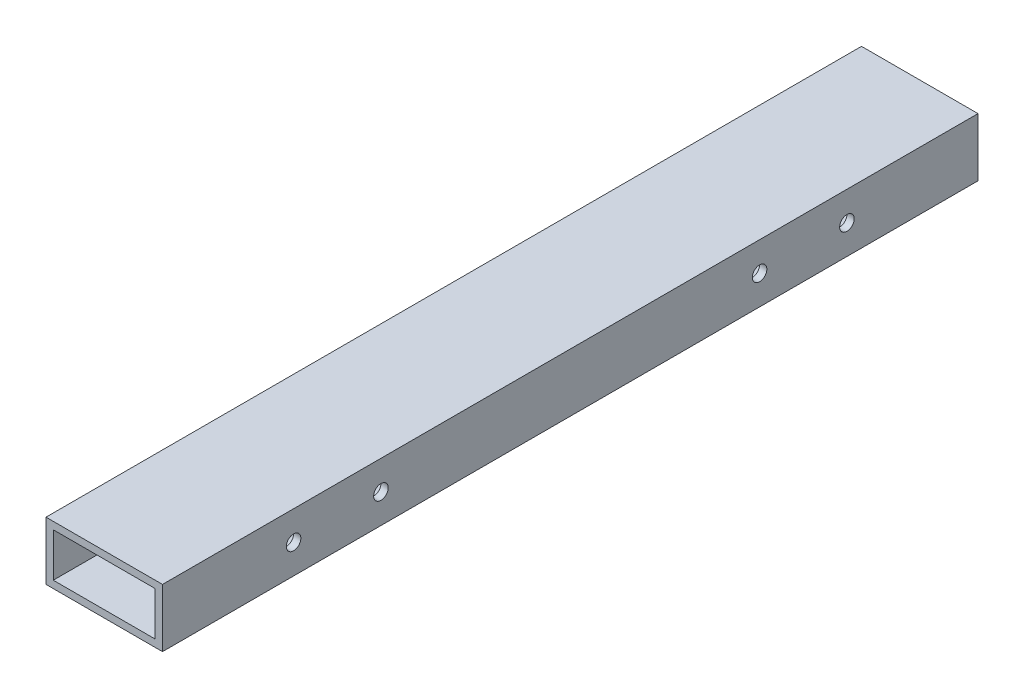
ISO-10303-21;
HEADER;
FILE_DESCRIPTION(('STEP AP214'),'2;1');
FILE_NAME('part.step','',(''),(''),'','','');
FILE_SCHEMA(('AUTOMOTIVE_DESIGN { 1 0 10303 214 1 1 1 1 }'));
ENDSEC;
DATA;
#1=APPLICATION_CONTEXT('core data for automotive mechanical design processes');
#2=APPLICATION_PROTOCOL_DEFINITION('international standard','automotive_design',2000,#1);
#3=PRODUCT_CONTEXT('',#1,'mechanical');
#4=PRODUCT('Part','Part','',(#3));
#5=PRODUCT_RELATED_PRODUCT_CATEGORY('part','',(#4));
#6=PRODUCT_DEFINITION_FORMATION('','',#4);
#7=PRODUCT_DEFINITION_CONTEXT('part definition',#1,'design');
#8=PRODUCT_DEFINITION('design','',#6,#7);
#9=PRODUCT_DEFINITION_SHAPE('','',#8);
#10=(LENGTH_UNIT() NAMED_UNIT(*) SI_UNIT(.MILLI.,.METRE.));
#11=(NAMED_UNIT(*) PLANE_ANGLE_UNIT() SI_UNIT($,.RADIAN.));
#12=(NAMED_UNIT(*) SI_UNIT($,.STERADIAN.) SOLID_ANGLE_UNIT());
#13=UNCERTAINTY_MEASURE_WITH_UNIT(LENGTH_MEASURE(1.E-05),#10,'distance_accuracy_value','');
#14=(GEOMETRIC_REPRESENTATION_CONTEXT(3) GLOBAL_UNCERTAINTY_ASSIGNED_CONTEXT((#13)) GLOBAL_UNIT_ASSIGNED_CONTEXT((#10,
#11,#12)) REPRESENTATION_CONTEXT('',''));
#15=CARTESIAN_POINT('',(0.,0.,0.));
#16=DIRECTION('',(0.,0.,1.));
#17=DIRECTION('',(1.,0.,0.));
#18=AXIS2_PLACEMENT_3D('',#15,#16,#17);
#19=CARTESIAN_POINT('',(0.,0.,355.6));
#20=DIRECTION('',(0.,0.,-1.));
#21=DIRECTION('',(-1.,0.,0.));
#22=AXIS2_PLACEMENT_3D('',#19,#20,#21);
#23=PLANE('',#22);
#24=DIRECTION('',(0.,-1.,0.));
#25=VECTOR('',#24,1.);
#26=CARTESIAN_POINT('',(0.,0.,355.6));
#27=LINE('',#26,#25);
#28=CARTESIAN_POINT('',(0.,25.4,355.6));
#29=VERTEX_POINT('',#28);
#30=CARTESIAN_POINT('',(0.,0.,355.6));
#31=VERTEX_POINT('',#30);
#32=EDGE_CURVE('E144',#29,#31,#27,.T.);
#33=ORIENTED_EDGE('',*,*,#32,.T.);
#34=DIRECTION('',(1.,0.,0.));
#35=VECTOR('',#34,1.);
#36=CARTESIAN_POINT('',(0.,0.,355.6));
#37=LINE('',#36,#35);
#38=CARTESIAN_POINT('',(50.8,0.,355.6));
#39=VERTEX_POINT('',#38);
#40=EDGE_CURVE('E147',#31,#39,#37,.T.);
#41=ORIENTED_EDGE('',*,*,#40,.T.);
#42=DIRECTION('',(0.,1.,0.));
#43=VECTOR('',#42,1.);
#44=CARTESIAN_POINT('',(50.8,0.,355.6));
#45=LINE('',#44,#43);
#46=CARTESIAN_POINT('',(50.8,25.4,355.6));
#47=VERTEX_POINT('',#46);
#48=EDGE_CURVE('E150',#39,#47,#45,.T.);
#49=ORIENTED_EDGE('',*,*,#48,.T.);
#50=DIRECTION('',(-1.,0.,0.));
#51=VECTOR('',#50,1.);
#52=CARTESIAN_POINT('',(0.,25.4,355.6));
#53=LINE('',#52,#51);
#54=EDGE_CURVE('E152',#47,#29,#53,.T.);
#55=ORIENTED_EDGE('',*,*,#54,.T.);
#56=EDGE_LOOP('',(#33,#41,#49,#55));
#57=FACE_BOUND('',#56,.T.);
#58=DIRECTION('',(0.,-1.,0.));
#59=VECTOR('',#58,1.);
#60=CARTESIAN_POINT('',(3.175,3.175,355.6));
#61=LINE('',#60,#59);
#62=CARTESIAN_POINT('',(3.175,22.225,355.6));
#63=VERTEX_POINT('',#62);
#64=CARTESIAN_POINT('',(3.175,3.175,355.6));
#65=VERTEX_POINT('',#64);
#66=EDGE_CURVE('E106',#63,#65,#61,.T.);
#67=ORIENTED_EDGE('',*,*,#66,.F.);
#68=DIRECTION('',(-1.,0.,0.));
#69=VECTOR('',#68,1.);
#70=CARTESIAN_POINT('',(3.175,22.225,355.6));
#71=LINE('',#70,#69);
#72=CARTESIAN_POINT('',(47.625,22.225,355.6));
#73=VERTEX_POINT('',#72);
#74=EDGE_CURVE('E128',#73,#63,#71,.T.);
#75=ORIENTED_EDGE('',*,*,#74,.F.);
#76=DIRECTION('',(0.,1.,0.));
#77=VECTOR('',#76,1.);
#78=CARTESIAN_POINT('',(47.625,3.175,355.6));
#79=LINE('',#78,#77);
#80=CARTESIAN_POINT('',(47.625,3.175,355.6));
#81=VERTEX_POINT('',#80);
#82=EDGE_CURVE('E126',#81,#73,#79,.T.);
#83=ORIENTED_EDGE('',*,*,#82,.F.);
#84=DIRECTION('',(1.,0.,0.));
#85=VECTOR('',#84,1.);
#86=CARTESIAN_POINT('',(3.175,3.175,355.6));
#87=LINE('',#86,#85);
#88=EDGE_CURVE('E114',#65,#81,#87,.T.);
#89=ORIENTED_EDGE('',*,*,#88,.F.);
#90=EDGE_LOOP('',(#67,#75,#83,#89));
#91=FACE_BOUND('',#90,.T.);
#92=ADVANCED_FACE('F39',(#57,#91),#23,.F.);
#93=CARTESIAN_POINT('',(0.,0.,0.));
#94=DIRECTION('',(0.,0.,-1.));
#95=DIRECTION('',(-1.,0.,0.));
#96=AXIS2_PLACEMENT_3D('',#93,#94,#95);
#97=PLANE('',#96);
#98=DIRECTION('',(0.,-1.,0.));
#99=VECTOR('',#98,1.);
#100=CARTESIAN_POINT('',(0.,0.,0.));
#101=LINE('',#100,#99);
#102=CARTESIAN_POINT('',(0.,25.4,0.));
#103=VERTEX_POINT('',#102);
#104=CARTESIAN_POINT('',(0.,0.,0.));
#105=VERTEX_POINT('',#104);
#106=EDGE_CURVE('E122',#103,#105,#101,.T.);
#107=ORIENTED_EDGE('',*,*,#106,.F.);
#108=DIRECTION('',(-1.,0.,0.));
#109=VECTOR('',#108,1.);
#110=CARTESIAN_POINT('',(0.,25.4,0.));
#111=LINE('',#110,#109);
#112=CARTESIAN_POINT('',(50.8,25.4,0.));
#113=VERTEX_POINT('',#112);
#114=EDGE_CURVE('E148',#113,#103,#111,.T.);
#115=ORIENTED_EDGE('',*,*,#114,.F.);
#116=DIRECTION('',(0.,1.,0.));
#117=VECTOR('',#116,1.);
#118=CARTESIAN_POINT('',(50.8,0.,0.));
#119=LINE('',#118,#117);
#120=CARTESIAN_POINT('',(50.8,0.,0.));
#121=VERTEX_POINT('',#120);
#122=EDGE_CURVE('E159',#121,#113,#119,.T.);
#123=ORIENTED_EDGE('',*,*,#122,.F.);
#124=DIRECTION('',(1.,0.,0.));
#125=VECTOR('',#124,1.);
#126=CARTESIAN_POINT('',(0.,0.,0.));
#127=LINE('',#126,#125);
#128=EDGE_CURVE('E157',#105,#121,#127,.T.);
#129=ORIENTED_EDGE('',*,*,#128,.F.);
#130=EDGE_LOOP('',(#107,#115,#123,#129));
#131=FACE_BOUND('',#130,.T.);
#132=DIRECTION('',(-1.,0.,0.));
#133=VECTOR('',#132,1.);
#134=CARTESIAN_POINT('',(3.175,22.225,0.));
#135=LINE('',#134,#133);
#136=CARTESIAN_POINT('',(47.625,22.225,0.));
#137=VERTEX_POINT('',#136);
#138=CARTESIAN_POINT('',(3.175,22.225,0.));
#139=VERTEX_POINT('',#138);
#140=EDGE_CURVE('E115',#137,#139,#135,.T.);
#141=ORIENTED_EDGE('',*,*,#140,.T.);
#142=DIRECTION('',(0.,-1.,0.));
#143=VECTOR('',#142,1.);
#144=CARTESIAN_POINT('',(3.175,3.175,0.));
#145=LINE('',#144,#143);
#146=CARTESIAN_POINT('',(3.175,3.175,0.));
#147=VERTEX_POINT('',#146);
#148=EDGE_CURVE('E64',#139,#147,#145,.T.);
#149=ORIENTED_EDGE('',*,*,#148,.T.);
#150=DIRECTION('',(1.,0.,0.));
#151=VECTOR('',#150,1.);
#152=CARTESIAN_POINT('',(3.175,3.175,0.));
#153=LINE('',#152,#151);
#154=CARTESIAN_POINT('',(47.625,3.175,0.));
#155=VERTEX_POINT('',#154);
#156=EDGE_CURVE('E121',#147,#155,#153,.T.);
#157=ORIENTED_EDGE('',*,*,#156,.T.);
#158=DIRECTION('',(0.,1.,0.));
#159=VECTOR('',#158,1.);
#160=CARTESIAN_POINT('',(47.625,3.175,0.));
#161=LINE('',#160,#159);
#162=EDGE_CURVE('E136',#155,#137,#161,.T.);
#163=ORIENTED_EDGE('',*,*,#162,.T.);
#164=EDGE_LOOP('',(#141,#149,#157,#163));
#165=FACE_BOUND('',#164,.T.);
#166=ADVANCED_FACE('F211',(#131,#165),#97,.T.);
#167=CARTESIAN_POINT('',(0.,0.,355.6));
#168=DIRECTION('',(1.,0.,0.));
#169=DIRECTION('',(0.,0.,-1.));
#170=AXIS2_PLACEMENT_3D('',#167,#168,#169);
#171=PLANE('',#170);
#172=CARTESIAN_POINT('',(0.,12.7,298.45));
#173=DIRECTION('',(1.,0.,0.));
#174=DIRECTION('',(0.,0.,-1.));
#175=AXIS2_PLACEMENT_3D('',#172,#173,#174);
#176=CIRCLE('',#175,3.17499999999997);
#177=CARTESIAN_POINT('',(0.,12.7,295.275));
#178=VERTEX_POINT('',#177);
#179=EDGE_CURVE('E173',#178,#178,#176,.T.);
#180=ORIENTED_EDGE('',*,*,#179,.T.);
#181=EDGE_LOOP('',(#180));
#182=FACE_BOUND('',#181,.T.);
#183=CARTESIAN_POINT('',(0.,12.7,95.25));
#184=DIRECTION('',(1.,0.,0.));
#185=DIRECTION('',(0.,0.,1.));
#186=AXIS2_PLACEMENT_3D('',#183,#184,#185);
#187=CIRCLE('',#186,3.17499999999997);
#188=CARTESIAN_POINT('',(0.,12.7,98.425));
#189=VERTEX_POINT('',#188);
#190=EDGE_CURVE('E269',#189,#189,#187,.T.);
#191=ORIENTED_EDGE('',*,*,#190,.T.);
#192=EDGE_LOOP('',(#191));
#193=FACE_BOUND('',#192,.T.);
#194=CARTESIAN_POINT('',(0.,12.7,57.15));
#195=DIRECTION('',(1.,0.,0.));
#196=DIRECTION('',(0.,0.,1.));
#197=AXIS2_PLACEMENT_3D('',#194,#195,#196);
#198=CIRCLE('',#197,3.17499999999997);
#199=CARTESIAN_POINT('',(0.,12.7,60.3249999999999));
#200=VERTEX_POINT('',#199);
#201=EDGE_CURVE('E273',#200,#200,#198,.T.);
#202=ORIENTED_EDGE('',*,*,#201,.T.);
#203=EDGE_LOOP('',(#202));
#204=FACE_BOUND('',#203,.T.);
#205=CARTESIAN_POINT('',(0.,12.7,260.35));
#206=DIRECTION('',(1.,0.,0.));
#207=DIRECTION('',(0.,0.,-1.));
#208=AXIS2_PLACEMENT_3D('',#205,#206,#207);
#209=CIRCLE('',#208,3.17499999999997);
#210=CARTESIAN_POINT('',(0.,12.7,257.175));
#211=VERTEX_POINT('',#210);
#212=EDGE_CURVE('E276',#211,#211,#209,.T.);
#213=ORIENTED_EDGE('',*,*,#212,.T.);
#214=EDGE_LOOP('',(#213));
#215=FACE_BOUND('',#214,.T.);
#216=ORIENTED_EDGE('',*,*,#106,.T.);
#217=DIRECTION('',(0.,0.,-1.));
#218=VECTOR('',#217,1.);
#219=CARTESIAN_POINT('',(0.,0.,355.6));
#220=LINE('',#219,#218);
#221=EDGE_CURVE('E11',#31,#105,#220,.T.);
#222=ORIENTED_EDGE('',*,*,#221,.F.);
#223=ORIENTED_EDGE('',*,*,#32,.F.);
#224=DIRECTION('',(0.,0.,-1.));
#225=VECTOR('',#224,1.);
#226=CARTESIAN_POINT('',(0.,25.4,355.6));
#227=LINE('',#226,#225);
#228=EDGE_CURVE('E154',#29,#103,#227,.T.);
#229=ORIENTED_EDGE('',*,*,#228,.T.);
#230=EDGE_LOOP('',(#216,#222,#223,#229));
#231=FACE_BOUND('',#230,.T.);
#232=ADVANCED_FACE('F41',(#182,#193,#204,#215,#231),#171,.F.);
#233=CARTESIAN_POINT('',(0.,0.,355.6));
#234=DIRECTION('',(0.,1.,0.));
#235=DIRECTION('',(0.,0.,1.));
#236=AXIS2_PLACEMENT_3D('',#233,#234,#235);
#237=PLANE('',#236);
#238=ORIENTED_EDGE('',*,*,#128,.T.);
#239=DIRECTION('',(0.,0.,-1.));
#240=VECTOR('',#239,1.);
#241=CARTESIAN_POINT('',(50.8,0.,355.6));
#242=LINE('',#241,#240);
#243=EDGE_CURVE('E48',#39,#121,#242,.T.);
#244=ORIENTED_EDGE('',*,*,#243,.F.);
#245=ORIENTED_EDGE('',*,*,#40,.F.);
#246=ORIENTED_EDGE('',*,*,#221,.T.);
#247=EDGE_LOOP('',(#238,#244,#245,#246));
#248=FACE_BOUND('',#247,.T.);
#249=ADVANCED_FACE('F242',(#248),#237,.F.);
#250=CARTESIAN_POINT('',(50.8,0.,355.6));
#251=DIRECTION('',(-1.,0.,0.));
#252=DIRECTION('',(0.,0.,1.));
#253=AXIS2_PLACEMENT_3D('',#250,#251,#252);
#254=PLANE('',#253);
#255=CARTESIAN_POINT('',(50.8,12.7,298.45));
#256=DIRECTION('',(1.,0.,0.));
#257=DIRECTION('',(0.,0.,-1.));
#258=AXIS2_PLACEMENT_3D('',#255,#256,#257);
#259=CIRCLE('',#258,3.17499999999997);
#260=CARTESIAN_POINT('',(50.8,12.7,295.275));
#261=VERTEX_POINT('',#260);
#262=EDGE_CURVE('E282',#261,#261,#259,.T.);
#263=ORIENTED_EDGE('',*,*,#262,.F.);
#264=EDGE_LOOP('',(#263));
#265=FACE_BOUND('',#264,.T.);
#266=CARTESIAN_POINT('',(50.8,12.7,95.25));
#267=DIRECTION('',(1.,0.,0.));
#268=DIRECTION('',(0.,0.,1.));
#269=AXIS2_PLACEMENT_3D('',#266,#267,#268);
#270=CIRCLE('',#269,3.17499999999997);
#271=CARTESIAN_POINT('',(50.8,12.7,98.425));
#272=VERTEX_POINT('',#271);
#273=EDGE_CURVE('E287',#272,#272,#270,.T.);
#274=ORIENTED_EDGE('',*,*,#273,.F.);
#275=EDGE_LOOP('',(#274));
#276=FACE_BOUND('',#275,.T.);
#277=CARTESIAN_POINT('',(50.8,12.7,57.15));
#278=DIRECTION('',(1.,0.,0.));
#279=DIRECTION('',(0.,0.,1.));
#280=AXIS2_PLACEMENT_3D('',#277,#278,#279);
#281=CIRCLE('',#280,3.17499999999997);
#282=CARTESIAN_POINT('',(50.8,12.7,60.3249999999999));
#283=VERTEX_POINT('',#282);
#284=EDGE_CURVE('E279',#283,#283,#281,.T.);
#285=ORIENTED_EDGE('',*,*,#284,.F.);
#286=EDGE_LOOP('',(#285));
#287=FACE_BOUND('',#286,.T.);
#288=CARTESIAN_POINT('',(50.8,12.7,260.35));
#289=DIRECTION('',(1.,0.,0.));
#290=DIRECTION('',(0.,0.,-1.));
#291=AXIS2_PLACEMENT_3D('',#288,#289,#290);
#292=CIRCLE('',#291,3.17499999999997);
#293=CARTESIAN_POINT('',(50.8,12.7,257.175));
#294=VERTEX_POINT('',#293);
#295=EDGE_CURVE('E278',#294,#294,#292,.T.);
#296=ORIENTED_EDGE('',*,*,#295,.F.);
#297=EDGE_LOOP('',(#296));
#298=FACE_BOUND('',#297,.T.);
#299=ORIENTED_EDGE('',*,*,#122,.T.);
#300=DIRECTION('',(0.,0.,-1.));
#301=VECTOR('',#300,1.);
#302=CARTESIAN_POINT('',(50.8,25.4,355.6));
#303=LINE('',#302,#301);
#304=EDGE_CURVE('E164',#47,#113,#303,.T.);
#305=ORIENTED_EDGE('',*,*,#304,.F.);
#306=ORIENTED_EDGE('',*,*,#48,.F.);
#307=ORIENTED_EDGE('',*,*,#243,.T.);
#308=EDGE_LOOP('',(#299,#305,#306,#307));
#309=FACE_BOUND('',#308,.T.);
#310=ADVANCED_FACE('F239',(#265,#276,#287,#298,#309),#254,.F.);
#311=CARTESIAN_POINT('',(0.,25.4,355.6));
#312=DIRECTION('',(0.,-1.,0.));
#313=DIRECTION('',(0.,0.,-1.));
#314=AXIS2_PLACEMENT_3D('',#311,#312,#313);
#315=PLANE('',#314);
#316=ORIENTED_EDGE('',*,*,#114,.T.);
#317=ORIENTED_EDGE('',*,*,#228,.F.);
#318=ORIENTED_EDGE('',*,*,#54,.F.);
#319=ORIENTED_EDGE('',*,*,#304,.T.);
#320=EDGE_LOOP('',(#316,#317,#318,#319));
#321=FACE_BOUND('',#320,.T.);
#322=ADVANCED_FACE('F236',(#321),#315,.F.);
#323=CARTESIAN_POINT('',(3.175,3.175,355.6));
#324=DIRECTION('',(1.,0.,0.));
#325=DIRECTION('',(0.,0.,-1.));
#326=AXIS2_PLACEMENT_3D('',#323,#324,#325);
#327=PLANE('',#326);
#328=CARTESIAN_POINT('',(3.175,12.7,298.45));
#329=DIRECTION('',(1.,0.,0.));
#330=DIRECTION('',(0.,0.,-1.));
#331=AXIS2_PLACEMENT_3D('',#328,#329,#330);
#332=CIRCLE('',#331,3.17499999999997);
#333=CARTESIAN_POINT('',(3.175,12.7,295.275));
#334=VERTEX_POINT('',#333);
#335=EDGE_CURVE('E134',#334,#334,#332,.T.);
#336=ORIENTED_EDGE('',*,*,#335,.F.);
#337=EDGE_LOOP('',(#336));
#338=FACE_BOUND('',#337,.T.);
#339=CARTESIAN_POINT('',(3.175,12.7,95.25));
#340=DIRECTION('',(1.,0.,0.));
#341=DIRECTION('',(0.,0.,-1.));
#342=AXIS2_PLACEMENT_3D('',#339,#340,#341);
#343=CIRCLE('',#342,3.17499999999997);
#344=CARTESIAN_POINT('',(3.175,12.7,92.075));
#345=VERTEX_POINT('',#344);
#346=EDGE_CURVE('E179',#345,#345,#343,.T.);
#347=ORIENTED_EDGE('',*,*,#346,.F.);
#348=EDGE_LOOP('',(#347));
#349=FACE_BOUND('',#348,.T.);
#350=CARTESIAN_POINT('',(3.175,12.7,57.15));
#351=DIRECTION('',(1.,0.,0.));
#352=DIRECTION('',(0.,0.,-1.));
#353=AXIS2_PLACEMENT_3D('',#350,#351,#352);
#354=CIRCLE('',#353,3.17499999999997);
#355=CARTESIAN_POINT('',(3.175,12.7,53.975));
#356=VERTEX_POINT('',#355);
#357=EDGE_CURVE('E176',#356,#356,#354,.T.);
#358=ORIENTED_EDGE('',*,*,#357,.F.);
#359=EDGE_LOOP('',(#358));
#360=FACE_BOUND('',#359,.T.);
#361=CARTESIAN_POINT('',(3.175,12.7,260.35));
#362=DIRECTION('',(1.,0.,0.));
#363=DIRECTION('',(0.,0.,-1.));
#364=AXIS2_PLACEMENT_3D('',#361,#362,#363);
#365=CIRCLE('',#364,3.17499999999997);
#366=CARTESIAN_POINT('',(3.175,12.7,257.175));
#367=VERTEX_POINT('',#366);
#368=EDGE_CURVE('E172',#367,#367,#365,.T.);
#369=ORIENTED_EDGE('',*,*,#368,.F.);
#370=EDGE_LOOP('',(#369));
#371=FACE_BOUND('',#370,.T.);
#372=ORIENTED_EDGE('',*,*,#148,.F.);
#373=DIRECTION('',(0.,0.,-1.));
#374=VECTOR('',#373,1.);
#375=CARTESIAN_POINT('',(3.175,22.225,355.6));
#376=LINE('',#375,#374);
#377=EDGE_CURVE('E110',#63,#139,#376,.T.);
#378=ORIENTED_EDGE('',*,*,#377,.F.);
#379=ORIENTED_EDGE('',*,*,#66,.T.);
#380=DIRECTION('',(0.,0.,-1.));
#381=VECTOR('',#380,1.);
#382=CARTESIAN_POINT('',(3.175,3.175,355.6));
#383=LINE('',#382,#381);
#384=EDGE_CURVE('E109',#65,#147,#383,.T.);
#385=ORIENTED_EDGE('',*,*,#384,.T.);
#386=EDGE_LOOP('',(#372,#378,#379,#385));
#387=FACE_BOUND('',#386,.T.);
#388=ADVANCED_FACE('F108',(#338,#349,#360,#371,#387),#327,.T.);
#389=CARTESIAN_POINT('',(3.175,3.175,355.6));
#390=DIRECTION('',(0.,1.,0.));
#391=DIRECTION('',(0.,0.,1.));
#392=AXIS2_PLACEMENT_3D('',#389,#390,#391);
#393=PLANE('',#392);
#394=ORIENTED_EDGE('',*,*,#156,.F.);
#395=ORIENTED_EDGE('',*,*,#384,.F.);
#396=ORIENTED_EDGE('',*,*,#88,.T.);
#397=DIRECTION('',(0.,0.,-1.));
#398=VECTOR('',#397,1.);
#399=CARTESIAN_POINT('',(47.625,3.175,355.6));
#400=LINE('',#399,#398);
#401=EDGE_CURVE('E123',#81,#155,#400,.T.);
#402=ORIENTED_EDGE('',*,*,#401,.T.);
#403=EDGE_LOOP('',(#394,#395,#396,#402));
#404=FACE_BOUND('',#403,.T.);
#405=ADVANCED_FACE('F118',(#404),#393,.T.);
#406=CARTESIAN_POINT('',(47.625,3.175,355.6));
#407=DIRECTION('',(-1.,0.,0.));
#408=DIRECTION('',(0.,0.,1.));
#409=AXIS2_PLACEMENT_3D('',#406,#407,#408);
#410=PLANE('',#409);
#411=CARTESIAN_POINT('',(47.625,12.7,298.45));
#412=DIRECTION('',(-1.,0.,0.));
#413=DIRECTION('',(0.,0.,1.));
#414=AXIS2_PLACEMENT_3D('',#411,#412,#413);
#415=CIRCLE('',#414,3.17499999999997);
#416=CARTESIAN_POINT('',(47.625,12.7,301.625));
#417=VERTEX_POINT('',#416);
#418=EDGE_CURVE('E43',#417,#417,#415,.T.);
#419=ORIENTED_EDGE('',*,*,#418,.F.);
#420=EDGE_LOOP('',(#419));
#421=FACE_BOUND('',#420,.T.);
#422=CARTESIAN_POINT('',(47.625,12.7,95.25));
#423=DIRECTION('',(-1.,0.,0.));
#424=DIRECTION('',(0.,0.,1.));
#425=AXIS2_PLACEMENT_3D('',#422,#423,#424);
#426=CIRCLE('',#425,3.17499999999997);
#427=CARTESIAN_POINT('',(47.625,12.7,98.425));
#428=VERTEX_POINT('',#427);
#429=EDGE_CURVE('E177',#428,#428,#426,.T.);
#430=ORIENTED_EDGE('',*,*,#429,.F.);
#431=EDGE_LOOP('',(#430));
#432=FACE_BOUND('',#431,.T.);
#433=CARTESIAN_POINT('',(47.625,12.7,57.15));
#434=DIRECTION('',(-1.,0.,0.));
#435=DIRECTION('',(0.,0.,1.));
#436=AXIS2_PLACEMENT_3D('',#433,#434,#435);
#437=CIRCLE('',#436,3.17499999999997);
#438=CARTESIAN_POINT('',(47.625,12.7,60.3249999999999));
#439=VERTEX_POINT('',#438);
#440=EDGE_CURVE('E174',#439,#439,#437,.T.);
#441=ORIENTED_EDGE('',*,*,#440,.F.);
#442=EDGE_LOOP('',(#441));
#443=FACE_BOUND('',#442,.T.);
#444=CARTESIAN_POINT('',(47.625,12.7,260.35));
#445=DIRECTION('',(-1.,0.,0.));
#446=DIRECTION('',(0.,0.,1.));
#447=AXIS2_PLACEMENT_3D('',#444,#445,#446);
#448=CIRCLE('',#447,3.17499999999997);
#449=CARTESIAN_POINT('',(47.625,12.7,263.525));
#450=VERTEX_POINT('',#449);
#451=EDGE_CURVE('E169',#450,#450,#448,.T.);
#452=ORIENTED_EDGE('',*,*,#451,.F.);
#453=EDGE_LOOP('',(#452));
#454=FACE_BOUND('',#453,.T.);
#455=ORIENTED_EDGE('',*,*,#162,.F.);
#456=ORIENTED_EDGE('',*,*,#401,.F.);
#457=ORIENTED_EDGE('',*,*,#82,.T.);
#458=DIRECTION('',(0.,0.,-1.));
#459=VECTOR('',#458,1.);
#460=CARTESIAN_POINT('',(47.625,22.225,355.6));
#461=LINE('',#460,#459);
#462=EDGE_CURVE('E56',#73,#137,#461,.T.);
#463=ORIENTED_EDGE('',*,*,#462,.T.);
#464=EDGE_LOOP('',(#455,#456,#457,#463));
#465=FACE_BOUND('',#464,.T.);
#466=ADVANCED_FACE('F199',(#421,#432,#443,#454,#465),#410,.T.);
#467=CARTESIAN_POINT('',(3.175,22.225,355.6));
#468=DIRECTION('',(0.,-1.,0.));
#469=DIRECTION('',(0.,0.,-1.));
#470=AXIS2_PLACEMENT_3D('',#467,#468,#469);
#471=PLANE('',#470);
#472=ORIENTED_EDGE('',*,*,#140,.F.);
#473=ORIENTED_EDGE('',*,*,#462,.F.);
#474=ORIENTED_EDGE('',*,*,#74,.T.);
#475=ORIENTED_EDGE('',*,*,#377,.T.);
#476=EDGE_LOOP('',(#472,#473,#474,#475));
#477=FACE_BOUND('',#476,.T.);
#478=ADVANCED_FACE('F202',(#477),#471,.T.);
#479=CARTESIAN_POINT('',(0.,12.7,260.35));
#480=DIRECTION('',(1.,0.,0.));
#481=DIRECTION('',(0.,0.,-1.));
#482=AXIS2_PLACEMENT_3D('',#479,#480,#481);
#483=CYLINDRICAL_SURFACE('',#482,3.17499999999997);
#484=ORIENTED_EDGE('',*,*,#451,.T.);
#485=EDGE_LOOP('',(#484));
#486=FACE_BOUND('',#485,.T.);
#487=ORIENTED_EDGE('',*,*,#295,.T.);
#488=EDGE_LOOP('',(#487));
#489=FACE_BOUND('',#488,.T.);
#490=ADVANCED_FACE('F213',(#486,#489),#483,.F.);
#491=CARTESIAN_POINT('',(0.,12.7,57.15));
#492=DIRECTION('',(1.,0.,0.));
#493=DIRECTION('',(0.,0.,-1.));
#494=AXIS2_PLACEMENT_3D('',#491,#492,#493);
#495=CYLINDRICAL_SURFACE('',#494,3.17499999999997);
#496=ORIENTED_EDGE('',*,*,#440,.T.);
#497=EDGE_LOOP('',(#496));
#498=FACE_BOUND('',#497,.T.);
#499=ORIENTED_EDGE('',*,*,#284,.T.);
#500=EDGE_LOOP('',(#499));
#501=FACE_BOUND('',#500,.T.);
#502=ADVANCED_FACE('F220',(#498,#501),#495,.F.);
#503=CARTESIAN_POINT('',(0.,12.7,95.25));
#504=DIRECTION('',(1.,0.,0.));
#505=DIRECTION('',(0.,0.,-1.));
#506=AXIS2_PLACEMENT_3D('',#503,#504,#505);
#507=CYLINDRICAL_SURFACE('',#506,3.17499999999997);
#508=ORIENTED_EDGE('',*,*,#429,.T.);
#509=EDGE_LOOP('',(#508));
#510=FACE_BOUND('',#509,.T.);
#511=ORIENTED_EDGE('',*,*,#273,.T.);
#512=EDGE_LOOP('',(#511));
#513=FACE_BOUND('',#512,.T.);
#514=ADVANCED_FACE('F304',(#510,#513),#507,.F.);
#515=CARTESIAN_POINT('',(0.,12.7,298.45));
#516=DIRECTION('',(1.,0.,0.));
#517=DIRECTION('',(0.,0.,-1.));
#518=AXIS2_PLACEMENT_3D('',#515,#516,#517);
#519=CYLINDRICAL_SURFACE('',#518,3.17499999999997);
#520=ORIENTED_EDGE('',*,*,#418,.T.);
#521=EDGE_LOOP('',(#520));
#522=FACE_BOUND('',#521,.T.);
#523=ORIENTED_EDGE('',*,*,#262,.T.);
#524=EDGE_LOOP('',(#523));
#525=FACE_BOUND('',#524,.T.);
#526=ADVANCED_FACE('F196',(#522,#525),#519,.F.);
#527=ORIENTED_EDGE('',*,*,#368,.T.);
#528=EDGE_LOOP('',(#527));
#529=FACE_BOUND('',#528,.T.);
#530=ORIENTED_EDGE('',*,*,#212,.F.);
#531=EDGE_LOOP('',(#530));
#532=FACE_BOUND('',#531,.T.);
#533=ADVANCED_FACE('F223',(#529,#532),#483,.F.);
#534=ORIENTED_EDGE('',*,*,#357,.T.);
#535=EDGE_LOOP('',(#534));
#536=FACE_BOUND('',#535,.T.);
#537=ORIENTED_EDGE('',*,*,#201,.F.);
#538=EDGE_LOOP('',(#537));
#539=FACE_BOUND('',#538,.T.);
#540=ADVANCED_FACE('F306',(#536,#539),#495,.F.);
#541=ORIENTED_EDGE('',*,*,#346,.T.);
#542=EDGE_LOOP('',(#541));
#543=FACE_BOUND('',#542,.T.);
#544=ORIENTED_EDGE('',*,*,#190,.F.);
#545=EDGE_LOOP('',(#544));
#546=FACE_BOUND('',#545,.T.);
#547=ADVANCED_FACE('F311',(#543,#546),#507,.F.);
#548=ORIENTED_EDGE('',*,*,#335,.T.);
#549=EDGE_LOOP('',(#548));
#550=FACE_BOUND('',#549,.T.);
#551=ORIENTED_EDGE('',*,*,#179,.F.);
#552=EDGE_LOOP('',(#551));
#553=FACE_BOUND('',#552,.T.);
#554=ADVANCED_FACE('F317',(#550,#553),#519,.F.);
#555=CLOSED_SHELL('',(#92,#166,#232,#249,#310,#322,#388,#405,#466,#478,#490,#502,#514,#526,#533,
#540,#547,#554));
#556=MANIFOLD_SOLID_BREP('B2',#555);
#557=ADVANCED_BREP_SHAPE_REPRESENTATION('',(#18,#556),#14);
#558=SHAPE_DEFINITION_REPRESENTATION(#9,#557);
ENDSEC;
END-ISO-10303-21;
